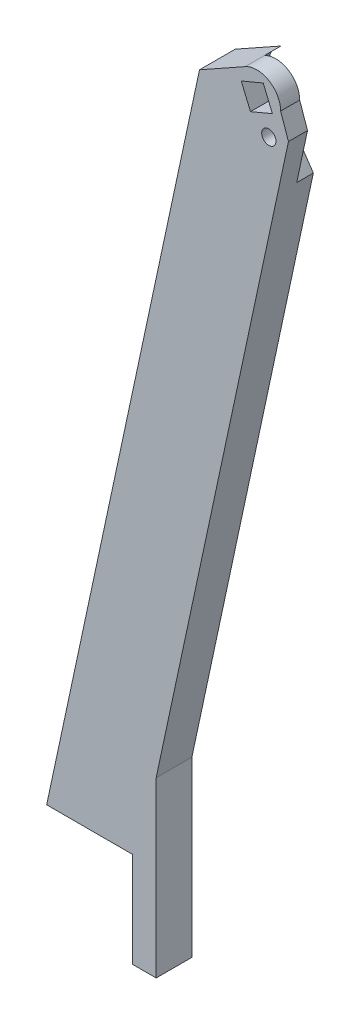
ISO-10303-21;
HEADER;
FILE_DESCRIPTION(('STEP AP214'),'2;1');
FILE_NAME('part.step','',(''),(''),'','','');
FILE_SCHEMA(('AUTOMOTIVE_DESIGN { 1 0 10303 214 1 1 1 1 }'));
ENDSEC;
DATA;
#1=APPLICATION_CONTEXT('core data for automotive mechanical design processes');
#2=APPLICATION_PROTOCOL_DEFINITION('international standard','automotive_design',2000,#1);
#3=PRODUCT_CONTEXT('',#1,'mechanical');
#4=PRODUCT('Part','Part','',(#3));
#5=PRODUCT_RELATED_PRODUCT_CATEGORY('part','',(#4));
#6=PRODUCT_DEFINITION_FORMATION('','',#4);
#7=PRODUCT_DEFINITION_CONTEXT('part definition',#1,'design');
#8=PRODUCT_DEFINITION('design','',#6,#7);
#9=PRODUCT_DEFINITION_SHAPE('','',#8);
#10=(LENGTH_UNIT() NAMED_UNIT(*) SI_UNIT(.MILLI.,.METRE.));
#11=(NAMED_UNIT(*) PLANE_ANGLE_UNIT() SI_UNIT($,.RADIAN.));
#12=(NAMED_UNIT(*) SI_UNIT($,.STERADIAN.) SOLID_ANGLE_UNIT());
#13=UNCERTAINTY_MEASURE_WITH_UNIT(LENGTH_MEASURE(1.E-05),#10,'distance_accuracy_value','');
#14=(GEOMETRIC_REPRESENTATION_CONTEXT(3) GLOBAL_UNCERTAINTY_ASSIGNED_CONTEXT((#13)) GLOBAL_UNIT_ASSIGNED_CONTEXT((#10,
#11,#12)) REPRESENTATION_CONTEXT('',''));
#15=CARTESIAN_POINT('',(0.,0.,0.));
#16=DIRECTION('',(0.,0.,1.));
#17=DIRECTION('',(1.,0.,0.));
#18=AXIS2_PLACEMENT_3D('',#15,#16,#17);
#19=CARTESIAN_POINT('',(6.35,0.,9.525));
#20=DIRECTION('',(0.,1.,0.));
#21=DIRECTION('',(0.,0.,1.));
#22=AXIS2_PLACEMENT_3D('',#19,#20,#21);
#23=PLANE('',#22);
#24=DIRECTION('',(1.,0.,0.));
#25=VECTOR('',#24,1.);
#26=CARTESIAN_POINT('',(6.35,0.,0.));
#27=LINE('',#26,#25);
#28=CARTESIAN_POINT('',(0.,0.,0.));
#29=VERTEX_POINT('',#28);
#30=CARTESIAN_POINT('',(6.35,0.,0.));
#31=VERTEX_POINT('',#30);
#32=EDGE_CURVE('E227',#29,#31,#27,.T.);
#33=ORIENTED_EDGE('',*,*,#32,.T.);
#34=DIRECTION('',(0.,0.,-1.));
#35=VECTOR('',#34,1.);
#36=CARTESIAN_POINT('',(6.35,0.,9.525));
#37=LINE('',#36,#35);
#38=CARTESIAN_POINT('',(6.35,0.,9.525));
#39=VERTEX_POINT('',#38);
#40=EDGE_CURVE('E11',#39,#31,#37,.T.);
#41=ORIENTED_EDGE('',*,*,#40,.F.);
#42=DIRECTION('',(1.,0.,0.));
#43=VECTOR('',#42,1.);
#44=CARTESIAN_POINT('',(6.35,0.,9.525));
#45=LINE('',#44,#43);
#46=CARTESIAN_POINT('',(0.,0.,9.525));
#47=VERTEX_POINT('',#46);
#48=EDGE_CURVE('E228',#47,#39,#45,.T.);
#49=ORIENTED_EDGE('',*,*,#48,.F.);
#50=DIRECTION('',(0.,0.,-1.));
#51=VECTOR('',#50,1.);
#52=CARTESIAN_POINT('',(0.,0.,9.525));
#53=LINE('',#52,#51);
#54=EDGE_CURVE('E253',#47,#29,#53,.T.);
#55=ORIENTED_EDGE('',*,*,#54,.T.);
#56=EDGE_LOOP('',(#33,#41,#49,#55));
#57=FACE_BOUND('',#56,.T.);
#58=ADVANCED_FACE('F45',(#57),#23,.F.);
#59=CARTESIAN_POINT('',(6.34999999999999,46.2565439416541,9.525));
#60=DIRECTION('',(-1.,0.,0.));
#61=DIRECTION('',(0.,-1.,0.));
#62=AXIS2_PLACEMENT_3D('',#59,#60,#61);
#63=PLANE('',#62);
#64=DIRECTION('',(0.,1.,0.));
#65=VECTOR('',#64,1.);
#66=CARTESIAN_POINT('',(6.34999999999999,46.2565439416541,0.));
#67=LINE('',#66,#65);
#68=CARTESIAN_POINT('',(6.34999999999999,46.2565439416541,0.));
#69=VERTEX_POINT('',#68);
#70=EDGE_CURVE('E257',#31,#69,#67,.T.);
#71=ORIENTED_EDGE('',*,*,#70,.T.);
#72=DIRECTION('',(0.,0.,-1.));
#73=VECTOR('',#72,1.);
#74=CARTESIAN_POINT('',(6.34999999999999,46.2565439416541,9.525));
#75=LINE('',#74,#73);
#76=CARTESIAN_POINT('',(6.34999999999999,46.2565439416541,9.525));
#77=VERTEX_POINT('',#76);
#78=EDGE_CURVE('E52',#77,#69,#75,.T.);
#79=ORIENTED_EDGE('',*,*,#78,.F.);
#80=DIRECTION('',(0.,1.,0.));
#81=VECTOR('',#80,1.);
#82=CARTESIAN_POINT('',(6.34999999999999,46.2565439416541,9.525));
#83=LINE('',#82,#81);
#84=EDGE_CURVE('E231',#39,#77,#83,.T.);
#85=ORIENTED_EDGE('',*,*,#84,.F.);
#86=ORIENTED_EDGE('',*,*,#40,.T.);
#87=EDGE_LOOP('',(#71,#79,#85,#86));
#88=FACE_BOUND('',#87,.T.);
#89=ADVANCED_FACE('F344',(#88),#63,.F.);
#90=CARTESIAN_POINT('',(6.34999999999999,46.2565439416541,9.525));
#91=DIRECTION('',(-0.977784225170926,0.20961395231924,0.));
#92=DIRECTION('',(-0.20961395231924,-0.977784225170926,0.));
#93=AXIS2_PLACEMENT_3D('',#90,#91,#92);
#94=PLANE('',#93);
#95=DIRECTION('',(0.,0.,-1.));
#96=VECTOR('',#95,1.);
#97=CARTESIAN_POINT('',(38.7488163513597,197.386996814956,34.2028616121804));
#98=LINE('',#97,#96);
#99=CARTESIAN_POINT('',(38.7488163513597,197.386996814956,4.445));
#100=VERTEX_POINT('',#99);
#101=CARTESIAN_POINT('',(38.7488163513597,197.386996814956,0.));
#102=VERTEX_POINT('',#101);
#103=EDGE_CURVE('E214',#100,#102,#98,.T.);
#104=ORIENTED_EDGE('',*,*,#103,.F.);
#105=DIRECTION('',(-0.209613952319239,-0.977784225170926,0.));
#106=VECTOR('',#105,1.);
#107=CARTESIAN_POINT('',(41.6379431335963,210.863879250183,4.445));
#108=LINE('',#107,#106);
#109=CARTESIAN_POINT('',(41.6379431335963,210.863879250183,4.445));
#110=VERTEX_POINT('',#109);
#111=EDGE_CURVE('E211',#110,#100,#108,.T.);
#112=ORIENTED_EDGE('',*,*,#111,.F.);
#113=DIRECTION('',(0.,0.,-1.));
#114=VECTOR('',#113,1.);
#115=CARTESIAN_POINT('',(41.6379431335963,210.863879250183,9.525));
#116=LINE('',#115,#114);
#117=CARTESIAN_POINT('',(41.6379431335963,210.863879250183,9.525));
#118=VERTEX_POINT('',#117);
#119=EDGE_CURVE('E294',#118,#110,#116,.T.);
#120=ORIENTED_EDGE('',*,*,#119,.F.);
#121=DIRECTION('',(0.20961395231924,0.977784225170926,0.));
#122=VECTOR('',#121,1.);
#123=CARTESIAN_POINT('',(6.34999999999999,46.2565439416541,9.525));
#124=LINE('',#123,#122);
#125=EDGE_CURVE('E235',#77,#118,#124,.T.);
#126=ORIENTED_EDGE('',*,*,#125,.F.);
#127=ORIENTED_EDGE('',*,*,#78,.T.);
#128=DIRECTION('',(0.20961395231924,0.977784225170926,0.));
#129=VECTOR('',#128,1.);
#130=CARTESIAN_POINT('',(6.34999999999999,46.2565439416541,0.));
#131=LINE('',#130,#129);
#132=EDGE_CURVE('E260',#69,#102,#131,.T.);
#133=ORIENTED_EDGE('',*,*,#132,.T.);
#134=EDGE_LOOP('',(#104,#112,#120,#126,#127,#133));
#135=FACE_BOUND('',#134,.T.);
#136=ADVANCED_FACE('F303',(#135),#94,.F.);
#137=CARTESIAN_POINT('',(41.6379431335963,210.863879250183,9.525));
#138=DIRECTION('',(-0.944497519735611,-0.328518546224227,0.));
#139=DIRECTION('',(0.328518546224227,-0.944497519735611,0.));
#140=AXIS2_PLACEMENT_3D('',#137,#138,#139);
#141=PLANE('',#140);
#142=ORIENTED_EDGE('',*,*,#119,.T.);
#143=DIRECTION('',(0.328518546224238,-0.944497519735607,0.));
#144=VECTOR('',#143,1.);
#145=CARTESIAN_POINT('',(41.6379431335963,210.863879250183,4.445));
#146=LINE('',#145,#144);
#147=CARTESIAN_POINT('',(39.5518503650725,216.861438500504,4.445));
#148=VERTEX_POINT('',#147);
#149=EDGE_CURVE('E215',#148,#110,#146,.T.);
#150=ORIENTED_EDGE('',*,*,#149,.F.);
#151=DIRECTION('',(0.,0.,-1.));
#152=VECTOR('',#151,1.);
#153=CARTESIAN_POINT('',(39.5518503650726,216.861438500505,9.525));
#154=LINE('',#153,#152);
#155=CARTESIAN_POINT('',(39.5518503650726,216.861438500505,9.525));
#156=VERTEX_POINT('',#155);
#157=EDGE_CURVE('E291',#156,#148,#154,.T.);
#158=ORIENTED_EDGE('',*,*,#157,.F.);
#159=DIRECTION('',(-0.328518546224227,0.944497519735611,0.));
#160=VECTOR('',#159,1.);
#161=CARTESIAN_POINT('',(41.6379431335963,210.863879250183,9.525));
#162=LINE('',#161,#160);
#163=EDGE_CURVE('E238',#118,#156,#162,.T.);
#164=ORIENTED_EDGE('',*,*,#163,.F.);
#165=EDGE_LOOP('',(#142,#150,#158,#164));
#166=FACE_BOUND('',#165,.T.);
#167=ADVANCED_FACE('F335',(#166),#141,.F.);
#168=CARTESIAN_POINT('',(33.2018503650725,216.861438500504,9.525));
#169=DIRECTION('',(0.,0.,-1.));
#170=DIRECTION('',(-1.,0.,0.));
#171=AXIS2_PLACEMENT_3D('',#168,#169,#170);
#172=CYLINDRICAL_SURFACE('',#171,6.35000000000009);
#173=ORIENTED_EDGE('',*,*,#157,.T.);
#174=CARTESIAN_POINT('',(33.2018503650725,216.861438500504,4.445));
#175=DIRECTION('',(0.,0.,1.));
#176=DIRECTION('',(1.,0.,0.));
#177=AXIS2_PLACEMENT_3D('',#174,#175,#176);
#178=CIRCLE('',#177,6.35);
#179=CARTESIAN_POINT('',(30.1004733095744,222.402553944134,4.445));
#180=VERTEX_POINT('',#179);
#181=EDGE_CURVE('E220',#180,#148,#178,.F.);
#182=ORIENTED_EDGE('',*,*,#181,.F.);
#183=DIRECTION('',(0.,0.,-1.));
#184=VECTOR('',#183,1.);
#185=CARTESIAN_POINT('',(30.1004733095743,222.402553944134,9.525));
#186=LINE('',#185,#184);
#187=CARTESIAN_POINT('',(30.1004733095743,222.402553944134,9.525));
#188=VERTEX_POINT('',#187);
#189=EDGE_CURVE('E288',#188,#180,#186,.T.);
#190=ORIENTED_EDGE('',*,*,#189,.F.);
#191=CARTESIAN_POINT('',(33.2018503650725,216.861438500504,9.525));
#192=DIRECTION('',(0.,0.,1.));
#193=DIRECTION('',(1.,0.,0.));
#194=AXIS2_PLACEMENT_3D('',#191,#192,#193);
#195=CIRCLE('',#194,6.35000000000009);
#196=EDGE_CURVE('E240',#156,#188,#195,.T.);
#197=ORIENTED_EDGE('',*,*,#196,.F.);
#198=EDGE_LOOP('',(#173,#182,#190,#197));
#199=FACE_BOUND('',#198,.T.);
#200=ADVANCED_FACE('F323',(#199),#172,.T.);
#201=CARTESIAN_POINT('',(17.9100193335887,215.579524422038,9.525));
#202=DIRECTION('',(0.488405835511519,-0.872616605295989,0.));
#203=DIRECTION('',(0.872616605295989,0.488405835511519,0.));
#204=AXIS2_PLACEMENT_3D('',#201,#202,#203);
#205=PLANE('',#204);
#206=DIRECTION('',(-0.872616605295989,-0.488405835511519,0.));
#207=VECTOR('',#206,1.);
#208=CARTESIAN_POINT('',(17.9100193335887,215.579524422038,0.));
#209=LINE('',#208,#207);
#210=CARTESIAN_POINT('',(30.1004733095744,222.402553944134,0.));
#211=VERTEX_POINT('',#210);
#212=CARTESIAN_POINT('',(17.9100193335887,215.579524422038,0.));
#213=VERTEX_POINT('',#212);
#214=EDGE_CURVE('E264',#211,#213,#209,.T.);
#215=ORIENTED_EDGE('',*,*,#214,.T.);
#216=DIRECTION('',(0.,0.,-1.));
#217=VECTOR('',#216,1.);
#218=CARTESIAN_POINT('',(17.9100193335887,215.579524422038,9.525));
#219=LINE('',#218,#217);
#220=CARTESIAN_POINT('',(17.9100193335887,215.579524422038,9.525));
#221=VERTEX_POINT('',#220);
#222=EDGE_CURVE('E285',#221,#213,#219,.T.);
#223=ORIENTED_EDGE('',*,*,#222,.F.);
#224=DIRECTION('',(-0.872616605295989,-0.488405835511519,0.));
#225=VECTOR('',#224,1.);
#226=CARTESIAN_POINT('',(17.9100193335887,215.579524422038,9.525));
#227=LINE('',#226,#225);
#228=EDGE_CURVE('E242',#188,#221,#227,.T.);
#229=ORIENTED_EDGE('',*,*,#228,.F.);
#230=ORIENTED_EDGE('',*,*,#189,.T.);
#231=DIRECTION('',(0.,0.,-1.));
#232=VECTOR('',#231,1.);
#233=CARTESIAN_POINT('',(30.1004733095743,222.402553944134,34.2028616121804));
#234=LINE('',#233,#232);
#235=EDGE_CURVE('E224',#180,#211,#234,.T.);
#236=ORIENTED_EDGE('',*,*,#235,.T.);
#237=EDGE_LOOP('',(#215,#223,#229,#230,#236));
#238=FACE_BOUND('',#237,.T.);
#239=ADVANCED_FACE('F328',(#238),#205,.F.);
#240=CARTESIAN_POINT('',(-22.86,25.4,9.525));
#241=DIRECTION('',(0.977784225170926,-0.20961395231924,0.));
#242=DIRECTION('',(0.20961395231924,0.977784225170926,0.));
#243=AXIS2_PLACEMENT_3D('',#240,#241,#242);
#244=PLANE('',#243);
#245=DIRECTION('',(-0.20961395231924,-0.977784225170926,0.));
#246=VECTOR('',#245,1.);
#247=CARTESIAN_POINT('',(-22.86,25.4,0.));
#248=LINE('',#247,#246);
#249=CARTESIAN_POINT('',(-22.86,25.4,0.));
#250=VERTEX_POINT('',#249);
#251=EDGE_CURVE('E266',#213,#250,#248,.T.);
#252=ORIENTED_EDGE('',*,*,#251,.T.);
#253=DIRECTION('',(0.,0.,-1.));
#254=VECTOR('',#253,1.);
#255=CARTESIAN_POINT('',(-22.86,25.4,9.525));
#256=LINE('',#255,#254);
#257=CARTESIAN_POINT('',(-22.86,25.4,9.525));
#258=VERTEX_POINT('',#257);
#259=EDGE_CURVE('E281',#258,#250,#256,.T.);
#260=ORIENTED_EDGE('',*,*,#259,.F.);
#261=DIRECTION('',(-0.20961395231924,-0.977784225170926,0.));
#262=VECTOR('',#261,1.);
#263=CARTESIAN_POINT('',(-22.86,25.4,9.525));
#264=LINE('',#263,#262);
#265=EDGE_CURVE('E244',#221,#258,#264,.T.);
#266=ORIENTED_EDGE('',*,*,#265,.F.);
#267=ORIENTED_EDGE('',*,*,#222,.T.);
#268=EDGE_LOOP('',(#252,#260,#266,#267));
#269=FACE_BOUND('',#268,.T.);
#270=ADVANCED_FACE('F365',(#269),#244,.F.);
#271=CARTESIAN_POINT('',(0.,25.4,9.525));
#272=DIRECTION('',(0.,1.,0.));
#273=DIRECTION('',(-1.,0.,0.));
#274=AXIS2_PLACEMENT_3D('',#271,#272,#273);
#275=PLANE('',#274);
#276=DIRECTION('',(1.,0.,0.));
#277=VECTOR('',#276,1.);
#278=CARTESIAN_POINT('',(0.,25.4,0.));
#279=LINE('',#278,#277);
#280=CARTESIAN_POINT('',(0.,25.4,0.));
#281=VERTEX_POINT('',#280);
#282=EDGE_CURVE('E269',#250,#281,#279,.T.);
#283=ORIENTED_EDGE('',*,*,#282,.T.);
#284=DIRECTION('',(0.,0.,-1.));
#285=VECTOR('',#284,1.);
#286=CARTESIAN_POINT('',(0.,25.4,9.525));
#287=LINE('',#286,#285);
#288=CARTESIAN_POINT('',(0.,25.4,9.525));
#289=VERTEX_POINT('',#288);
#290=EDGE_CURVE('E277',#289,#281,#287,.T.);
#291=ORIENTED_EDGE('',*,*,#290,.F.);
#292=DIRECTION('',(1.,0.,0.));
#293=VECTOR('',#292,1.);
#294=CARTESIAN_POINT('',(0.,25.4,9.525));
#295=LINE('',#294,#293);
#296=EDGE_CURVE('E247',#258,#289,#295,.T.);
#297=ORIENTED_EDGE('',*,*,#296,.F.);
#298=ORIENTED_EDGE('',*,*,#259,.T.);
#299=EDGE_LOOP('',(#283,#291,#297,#298));
#300=FACE_BOUND('',#299,.T.);
#301=ADVANCED_FACE('F363',(#300),#275,.F.);
#302=CARTESIAN_POINT('',(0.,0.,9.525));
#303=DIRECTION('',(1.,0.,0.));
#304=DIRECTION('',(0.,0.,-1.));
#305=AXIS2_PLACEMENT_3D('',#302,#303,#304);
#306=PLANE('',#305);
#307=DIRECTION('',(0.,-1.,0.));
#308=VECTOR('',#307,1.);
#309=CARTESIAN_POINT('',(0.,0.,0.));
#310=LINE('',#309,#308);
#311=EDGE_CURVE('E232',#281,#29,#310,.T.);
#312=ORIENTED_EDGE('',*,*,#311,.T.);
#313=ORIENTED_EDGE('',*,*,#54,.F.);
#314=DIRECTION('',(0.,-1.,0.));
#315=VECTOR('',#314,1.);
#316=CARTESIAN_POINT('',(0.,0.,9.525));
#317=LINE('',#316,#315);
#318=EDGE_CURVE('E250',#289,#47,#317,.T.);
#319=ORIENTED_EDGE('',*,*,#318,.F.);
#320=ORIENTED_EDGE('',*,*,#290,.T.);
#321=EDGE_LOOP('',(#312,#313,#319,#320));
#322=FACE_BOUND('',#321,.T.);
#323=ADVANCED_FACE('F358',(#322),#306,.F.);
#324=CARTESIAN_POINT('',(33.2018503650725,216.861438500504,9.525));
#325=DIRECTION('',(0.,0.,1.));
#326=DIRECTION('',(1.,0.,0.));
#327=AXIS2_PLACEMENT_3D('',#324,#325,#326);
#328=PLANE('',#327);
#329=DIRECTION('',(0.921923090636116,0.387372966212088,0.));
#330=VECTOR('',#329,1.);
#331=CARTESIAN_POINT('',(34.8990470101186,221.018453480997,9.525));
#332=LINE('',#331,#330);
#333=CARTESIAN_POINT('',(29.0448353845792,218.55863514555,9.525));
#334=VERTEX_POINT('',#333);
#335=CARTESIAN_POINT('',(34.8990470101186,221.018453480997,9.525));
#336=VERTEX_POINT('',#335);
#337=EDGE_CURVE('E163',#334,#336,#332,.T.);
#338=ORIENTED_EDGE('',*,*,#337,.T.);
#339=DIRECTION('',(0.387372966212084,-0.921923090636118,0.));
#340=VECTOR('',#339,1.);
#341=CARTESIAN_POINT('',(37.3588653455653,215.164241855458,9.525));
#342=LINE('',#341,#340);
#343=CARTESIAN_POINT('',(37.3588653455653,215.164241855458,9.525));
#344=VERTEX_POINT('',#343);
#345=EDGE_CURVE('E172',#336,#344,#342,.T.);
#346=ORIENTED_EDGE('',*,*,#345,.T.);
#347=DIRECTION('',(-0.921923090636116,-0.387372966212088,0.));
#348=VECTOR('',#347,1.);
#349=CARTESIAN_POINT('',(31.504653720026,212.704423520011,9.525));
#350=LINE('',#349,#348);
#351=CARTESIAN_POINT('',(31.504653720026,212.704423520011,9.525));
#352=VERTEX_POINT('',#351);
#353=EDGE_CURVE('E59',#344,#352,#350,.T.);
#354=ORIENTED_EDGE('',*,*,#353,.T.);
#355=DIRECTION('',(-0.387372966212084,0.921923090636118,0.));
#356=VECTOR('',#355,1.);
#357=CARTESIAN_POINT('',(29.0448353845792,218.55863514555,9.525));
#358=LINE('',#357,#356);
#359=EDGE_CURVE('E169',#352,#334,#358,.T.);
#360=ORIENTED_EDGE('',*,*,#359,.T.);
#361=EDGE_LOOP('',(#338,#346,#354,#360));
#362=FACE_BOUND('',#361,.T.);
#363=CARTESIAN_POINT('',(36.3996142011536,209.250963387303,9.525));
#364=DIRECTION('',(0.,0.,-1.));
#365=DIRECTION('',(-1.,0.,0.));
#366=AXIS2_PLACEMENT_3D('',#363,#364,#365);
#367=CIRCLE('',#366,1.905);
#368=CARTESIAN_POINT('',(34.4946142011537,209.250963387303,9.525));
#369=VERTEX_POINT('',#368);
#370=EDGE_CURVE('E201',#369,#369,#367,.T.);
#371=ORIENTED_EDGE('',*,*,#370,.T.);
#372=EDGE_LOOP('',(#371));
#373=FACE_BOUND('',#372,.T.);
#374=ORIENTED_EDGE('',*,*,#48,.T.);
#375=ORIENTED_EDGE('',*,*,#84,.T.);
#376=ORIENTED_EDGE('',*,*,#125,.T.);
#377=ORIENTED_EDGE('',*,*,#163,.T.);
#378=ORIENTED_EDGE('',*,*,#196,.T.);
#379=ORIENTED_EDGE('',*,*,#228,.T.);
#380=ORIENTED_EDGE('',*,*,#265,.T.);
#381=ORIENTED_EDGE('',*,*,#296,.T.);
#382=ORIENTED_EDGE('',*,*,#318,.T.);
#383=EDGE_LOOP('',(#374,#375,#376,#377,#378,#379,#380,#381,#382));
#384=FACE_BOUND('',#383,.T.);
#385=ADVANCED_FACE('F176',(#362,#373,#384),#328,.T.);
#386=CARTESIAN_POINT('',(33.2018503650725,216.861438500504,0.));
#387=DIRECTION('',(0.,0.,1.));
#388=DIRECTION('',(1.,0.,0.));
#389=AXIS2_PLACEMENT_3D('',#386,#387,#388);
#390=PLANE('',#389);
#391=CARTESIAN_POINT('',(33.2018503650725,216.861438500504,0.));
#392=DIRECTION('',(0.,0.,-1.));
#393=DIRECTION('',(-1.,0.,0.));
#394=AXIS2_PLACEMENT_3D('',#391,#392,#393);
#395=CIRCLE('',#394,6.35);
#396=CARTESIAN_POINT('',(27.9483164232422,213.294523710095,0.));
#397=VERTEX_POINT('',#396);
#398=EDGE_CURVE('E204',#397,#211,#395,.T.);
#399=ORIENTED_EDGE('',*,*,#398,.F.);
#400=DIRECTION('',(-0.561718864631317,0.827328179815788,0.));
#401=VECTOR('',#400,1.);
#402=CARTESIAN_POINT('',(38.7488163513597,197.386996814956,0.));
#403=LINE('',#402,#401);
#404=EDGE_CURVE('E195',#102,#397,#403,.T.);
#405=ORIENTED_EDGE('',*,*,#404,.F.);
#406=ORIENTED_EDGE('',*,*,#132,.F.);
#407=ORIENTED_EDGE('',*,*,#70,.F.);
#408=ORIENTED_EDGE('',*,*,#32,.F.);
#409=ORIENTED_EDGE('',*,*,#311,.F.);
#410=ORIENTED_EDGE('',*,*,#282,.F.);
#411=ORIENTED_EDGE('',*,*,#251,.F.);
#412=ORIENTED_EDGE('',*,*,#214,.F.);
#413=EDGE_LOOP('',(#399,#405,#406,#407,#408,#409,#410,#411,#412));
#414=FACE_BOUND('',#413,.T.);
#415=ADVANCED_FACE('F309',(#414),#390,.F.);
#416=CARTESIAN_POINT('',(33.2018503650725,216.861438500504,34.2028616121804));
#417=DIRECTION('',(0.,0.,-1.));
#418=DIRECTION('',(-1.,0.,0.));
#419=AXIS2_PLACEMENT_3D('',#416,#417,#418);
#420=CYLINDRICAL_SURFACE('',#419,6.35);
#421=CARTESIAN_POINT('',(27.9483164232422,213.294523710095,4.445));
#422=VERTEX_POINT('',#421);
#423=EDGE_CURVE('E217',#422,#180,#178,.F.);
#424=ORIENTED_EDGE('',*,*,#423,.F.);
#425=DIRECTION('',(0.,0.,-1.));
#426=VECTOR('',#425,1.);
#427=CARTESIAN_POINT('',(27.9483164232422,213.294523710095,34.2028616121804));
#428=LINE('',#427,#426);
#429=EDGE_CURVE('E210',#422,#397,#428,.T.);
#430=ORIENTED_EDGE('',*,*,#429,.T.);
#431=ORIENTED_EDGE('',*,*,#398,.T.);
#432=ORIENTED_EDGE('',*,*,#235,.F.);
#433=EDGE_LOOP('',(#424,#430,#431,#432));
#434=FACE_BOUND('',#433,.T.);
#435=ADVANCED_FACE('F316',(#434),#420,.F.);
#436=CARTESIAN_POINT('',(33.2018503650723,216.861438500504,4.445));
#437=DIRECTION('',(0.,0.,1.));
#438=DIRECTION('',(0.921923090636118,0.387372966212085,0.));
#439=AXIS2_PLACEMENT_3D('',#436,#437,#438);
#440=PLANE('',#439);
#441=DIRECTION('',(0.387372966212084,-0.921923090636118,0.));
#442=VECTOR('',#441,1.);
#443=CARTESIAN_POINT('',(37.3588653455653,215.164241855458,4.445));
#444=LINE('',#443,#442);
#445=CARTESIAN_POINT('',(34.8990470101186,221.018453480997,4.445));
#446=VERTEX_POINT('',#445);
#447=CARTESIAN_POINT('',(37.3588653455653,215.164241855458,4.445));
#448=VERTEX_POINT('',#447);
#449=EDGE_CURVE('E188',#446,#448,#444,.T.);
#450=ORIENTED_EDGE('',*,*,#449,.F.);
#451=DIRECTION('',(0.921923090636116,0.387372966212088,0.));
#452=VECTOR('',#451,1.);
#453=CARTESIAN_POINT('',(34.8990470101186,221.018453480997,4.445));
#454=LINE('',#453,#452);
#455=CARTESIAN_POINT('',(29.0448353845792,218.55863514555,4.445));
#456=VERTEX_POINT('',#455);
#457=EDGE_CURVE('E67',#456,#446,#454,.T.);
#458=ORIENTED_EDGE('',*,*,#457,.F.);
#459=DIRECTION('',(-0.387372966212084,0.921923090636118,0.));
#460=VECTOR('',#459,1.);
#461=CARTESIAN_POINT('',(29.0448353845792,218.55863514555,4.445));
#462=LINE('',#461,#460);
#463=CARTESIAN_POINT('',(31.504653720026,212.704423520011,4.445));
#464=VERTEX_POINT('',#463);
#465=EDGE_CURVE('E179',#464,#456,#462,.T.);
#466=ORIENTED_EDGE('',*,*,#465,.F.);
#467=DIRECTION('',(-0.921923090636116,-0.387372966212088,0.));
#468=VECTOR('',#467,1.);
#469=CARTESIAN_POINT('',(31.504653720026,212.704423520011,4.445));
#470=LINE('',#469,#468);
#471=EDGE_CURVE('E182',#448,#464,#470,.T.);
#472=ORIENTED_EDGE('',*,*,#471,.F.);
#473=EDGE_LOOP('',(#450,#458,#466,#472));
#474=FACE_BOUND('',#473,.T.);
#475=CARTESIAN_POINT('',(36.3996142011536,209.250963387303,4.445));
#476=DIRECTION('',(0.,0.,-1.));
#477=DIRECTION('',(-1.,0.,0.));
#478=AXIS2_PLACEMENT_3D('',#475,#476,#477);
#479=CIRCLE('',#478,1.905);
#480=CARTESIAN_POINT('',(34.4946142011537,209.250963387303,4.445));
#481=VERTEX_POINT('',#480);
#482=EDGE_CURVE('E189',#481,#481,#479,.T.);
#483=ORIENTED_EDGE('',*,*,#482,.F.);
#484=EDGE_LOOP('',(#483));
#485=FACE_BOUND('',#484,.T.);
#486=ORIENTED_EDGE('',*,*,#111,.T.);
#487=DIRECTION('',(-0.561718864631317,0.827328179815788,0.));
#488=VECTOR('',#487,1.);
#489=CARTESIAN_POINT('',(38.7488163513597,197.386996814956,4.445));
#490=LINE('',#489,#488);
#491=EDGE_CURVE('E206',#100,#422,#490,.T.);
#492=ORIENTED_EDGE('',*,*,#491,.T.);
#493=ORIENTED_EDGE('',*,*,#423,.T.);
#494=ORIENTED_EDGE('',*,*,#181,.T.);
#495=ORIENTED_EDGE('',*,*,#149,.T.);
#496=EDGE_LOOP('',(#486,#492,#493,#494,#495));
#497=FACE_BOUND('',#496,.T.);
#498=ADVANCED_FACE('F319',(#474,#485,#497),#440,.F.);
#499=CARTESIAN_POINT('',(38.7488163513597,197.386996814956,34.2028616121804));
#500=DIRECTION('',(-0.827328179815788,-0.561718864631317,0.));
#501=DIRECTION('',(0.561718864631317,-0.827328179815788,0.));
#502=AXIS2_PLACEMENT_3D('',#499,#500,#501);
#503=PLANE('',#502);
#504=ORIENTED_EDGE('',*,*,#103,.T.);
#505=ORIENTED_EDGE('',*,*,#404,.T.);
#506=ORIENTED_EDGE('',*,*,#429,.F.);
#507=ORIENTED_EDGE('',*,*,#491,.F.);
#508=EDGE_LOOP('',(#504,#505,#506,#507));
#509=FACE_BOUND('',#508,.T.);
#510=ADVANCED_FACE('F314',(#509),#503,.F.);
#511=CARTESIAN_POINT('',(36.3996142011536,209.250963387303,9.525));
#512=DIRECTION('',(0.,0.,-1.));
#513=DIRECTION('',(-1.,0.,0.));
#514=AXIS2_PLACEMENT_3D('',#511,#512,#513);
#515=CYLINDRICAL_SURFACE('',#514,1.905);
#516=ORIENTED_EDGE('',*,*,#370,.F.);
#517=EDGE_LOOP('',(#516));
#518=FACE_BOUND('',#517,.T.);
#519=ORIENTED_EDGE('',*,*,#482,.T.);
#520=EDGE_LOOP('',(#519));
#521=FACE_BOUND('',#520,.T.);
#522=ADVANCED_FACE('F385',(#518,#521),#515,.F.);
#523=CARTESIAN_POINT('',(34.8990470101186,221.018453480997,9.525));
#524=DIRECTION('',(-0.387372966212088,0.921923090636117,0.));
#525=DIRECTION('',(-0.921923090636117,-0.387372966212088,0.));
#526=AXIS2_PLACEMENT_3D('',#523,#524,#525);
#527=PLANE('',#526);
#528=ORIENTED_EDGE('',*,*,#457,.T.);
#529=DIRECTION('',(0.,0.,-1.));
#530=VECTOR('',#529,1.);
#531=CARTESIAN_POINT('',(34.8990470101186,221.018453480997,9.525));
#532=LINE('',#531,#530);
#533=EDGE_CURVE('E159',#336,#446,#532,.T.);
#534=ORIENTED_EDGE('',*,*,#533,.F.);
#535=ORIENTED_EDGE('',*,*,#337,.F.);
#536=DIRECTION('',(0.,0.,-1.));
#537=VECTOR('',#536,1.);
#538=CARTESIAN_POINT('',(29.0448353845792,218.55863514555,9.525));
#539=LINE('',#538,#537);
#540=EDGE_CURVE('E193',#334,#456,#539,.T.);
#541=ORIENTED_EDGE('',*,*,#540,.T.);
#542=EDGE_LOOP('',(#528,#534,#535,#541));
#543=FACE_BOUND('',#542,.T.);
#544=ADVANCED_FACE('F161',(#543),#527,.F.);
#545=CARTESIAN_POINT('',(29.0448353845792,218.55863514555,9.525));
#546=DIRECTION('',(-0.921923090636118,-0.387372966212084,0.));
#547=DIRECTION('',(0.387372966212084,-0.921923090636118,0.));
#548=AXIS2_PLACEMENT_3D('',#545,#546,#547);
#549=PLANE('',#548);
#550=ORIENTED_EDGE('',*,*,#465,.T.);
#551=ORIENTED_EDGE('',*,*,#540,.F.);
#552=ORIENTED_EDGE('',*,*,#359,.F.);
#553=DIRECTION('',(0.,0.,-1.));
#554=VECTOR('',#553,1.);
#555=CARTESIAN_POINT('',(31.504653720026,212.704423520011,9.525));
#556=LINE('',#555,#554);
#557=EDGE_CURVE('E196',#352,#464,#556,.T.);
#558=ORIENTED_EDGE('',*,*,#557,.T.);
#559=EDGE_LOOP('',(#550,#551,#552,#558));
#560=FACE_BOUND('',#559,.T.);
#561=ADVANCED_FACE('F393',(#560),#549,.F.);
#562=CARTESIAN_POINT('',(31.504653720026,212.704423520011,9.525));
#563=DIRECTION('',(0.387372966212088,-0.921923090636117,0.));
#564=DIRECTION('',(0.921923090636117,0.387372966212088,0.));
#565=AXIS2_PLACEMENT_3D('',#562,#563,#564);
#566=PLANE('',#565);
#567=ORIENTED_EDGE('',*,*,#471,.T.);
#568=ORIENTED_EDGE('',*,*,#557,.F.);
#569=ORIENTED_EDGE('',*,*,#353,.F.);
#570=DIRECTION('',(0.,0.,-1.));
#571=VECTOR('',#570,1.);
#572=CARTESIAN_POINT('',(37.3588653455653,215.164241855458,9.525));
#573=LINE('',#572,#571);
#574=EDGE_CURVE('E168',#344,#448,#573,.T.);
#575=ORIENTED_EDGE('',*,*,#574,.T.);
#576=EDGE_LOOP('',(#567,#568,#569,#575));
#577=FACE_BOUND('',#576,.T.);
#578=ADVANCED_FACE('F396',(#577),#566,.F.);
#579=CARTESIAN_POINT('',(37.3588653455653,215.164241855458,9.525));
#580=DIRECTION('',(0.921923090636118,0.387372966212084,0.));
#581=DIRECTION('',(-0.387372966212084,0.921923090636118,0.));
#582=AXIS2_PLACEMENT_3D('',#579,#580,#581);
#583=PLANE('',#582);
#584=ORIENTED_EDGE('',*,*,#449,.T.);
#585=ORIENTED_EDGE('',*,*,#574,.F.);
#586=ORIENTED_EDGE('',*,*,#345,.F.);
#587=ORIENTED_EDGE('',*,*,#533,.T.);
#588=EDGE_LOOP('',(#584,#585,#586,#587));
#589=FACE_BOUND('',#588,.T.);
#590=ADVANCED_FACE('F173',(#589),#583,.F.);
#591=CLOSED_SHELL('',(#58,#89,#136,#167,#200,#239,#270,#301,#323,#385,#415,#435,#498,#510,#522,
#544,#561,#578,#590));
#592=MANIFOLD_SOLID_BREP('B2',#591);
#593=ADVANCED_BREP_SHAPE_REPRESENTATION('',(#18,#592),#14);
#594=SHAPE_DEFINITION_REPRESENTATION(#9,#593);
ENDSEC;
END-ISO-10303-21;
